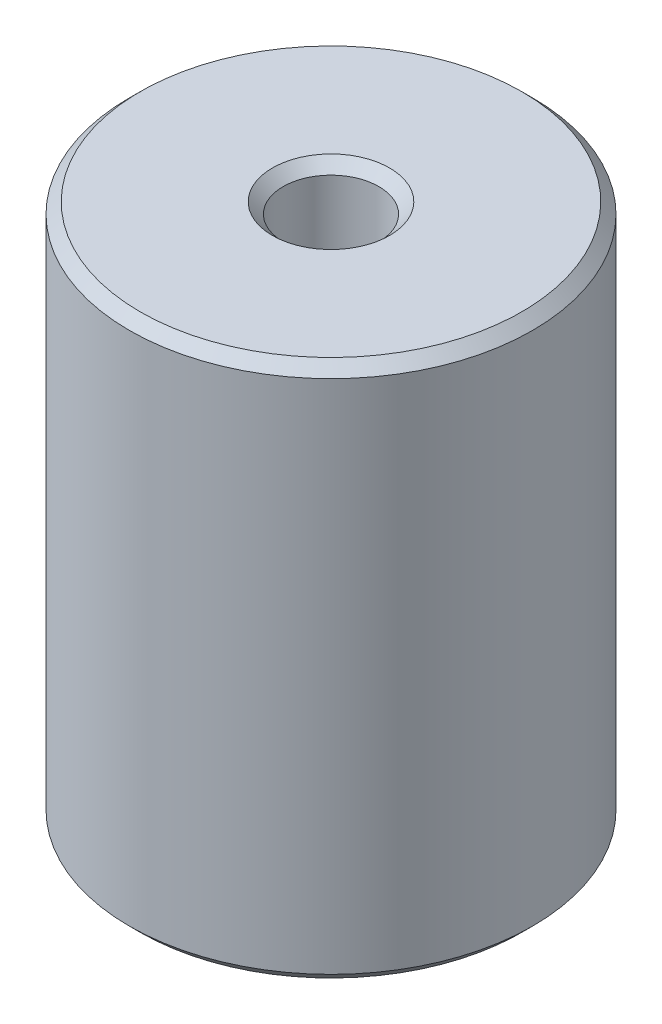
ISO-10303-21;
HEADER;
FILE_DESCRIPTION(('STEP AP214'),'2;1');
FILE_NAME('part.step','',(''),(''),'','','');
FILE_SCHEMA(('AUTOMOTIVE_DESIGN { 1 0 10303 214 1 1 1 1 }'));
ENDSEC;
DATA;
#1=APPLICATION_CONTEXT('core data for automotive mechanical design processes');
#2=APPLICATION_PROTOCOL_DEFINITION('international standard','automotive_design',2000,#1);
#3=PRODUCT_CONTEXT('',#1,'mechanical');
#4=PRODUCT('Part','Part','',(#3));
#5=PRODUCT_RELATED_PRODUCT_CATEGORY('part','',(#4));
#6=PRODUCT_DEFINITION_FORMATION('','',#4);
#7=PRODUCT_DEFINITION_CONTEXT('part definition',#1,'design');
#8=PRODUCT_DEFINITION('design','',#6,#7);
#9=PRODUCT_DEFINITION_SHAPE('','',#8);
#10=(LENGTH_UNIT() NAMED_UNIT(*) SI_UNIT(.MILLI.,.METRE.));
#11=(NAMED_UNIT(*) PLANE_ANGLE_UNIT() SI_UNIT($,.RADIAN.));
#12=(NAMED_UNIT(*) SI_UNIT($,.STERADIAN.) SOLID_ANGLE_UNIT());
#13=UNCERTAINTY_MEASURE_WITH_UNIT(LENGTH_MEASURE(1.E-05),#10,'distance_accuracy_value','');
#14=(GEOMETRIC_REPRESENTATION_CONTEXT(3) GLOBAL_UNCERTAINTY_ASSIGNED_CONTEXT((#13)) GLOBAL_UNIT_ASSIGNED_CONTEXT((#10,
#11,#12)) REPRESENTATION_CONTEXT('',''));
#15=CARTESIAN_POINT('',(0.,0.,0.));
#16=DIRECTION('',(0.,0.,1.));
#17=DIRECTION('',(1.,0.,0.));
#18=AXIS2_PLACEMENT_3D('',#15,#16,#17);
#19=CARTESIAN_POINT('',(0.,12.7,0.));
#20=DIRECTION('',(0.,1.,0.));
#21=DIRECTION('',(0.,0.,1.));
#22=AXIS2_PLACEMENT_3D('',#19,#20,#21);
#23=PLANE('',#22);
#24=CARTESIAN_POINT('',(0.,12.7,0.));
#25=DIRECTION('',(0.,1.,0.));
#26=DIRECTION('',(0.,0.,1.));
#27=AXIS2_PLACEMENT_3D('',#24,#25,#26);
#28=CIRCLE('',#27,1.3843);
#29=CARTESIAN_POINT('',(0.,12.7,1.3843));
#30=VERTEX_POINT('',#29);
#31=EDGE_CURVE('E10',#30,#30,#28,.F.);
#32=ORIENTED_EDGE('',*,*,#31,.T.);
#33=EDGE_LOOP('',(#32));
#34=FACE_BOUND('',#33,.T.);
#35=CARTESIAN_POINT('',(0.,12.7,0.));
#36=DIRECTION('',(0.,1.,0.));
#37=DIRECTION('',(0.,0.,1.));
#38=AXIS2_PLACEMENT_3D('',#35,#36,#37);
#39=CIRCLE('',#38,4.5085);
#40=CARTESIAN_POINT('',(0.,12.7,4.5085));
#41=VERTEX_POINT('',#40);
#42=EDGE_CURVE('E40',#41,#41,#39,.T.);
#43=ORIENTED_EDGE('',*,*,#42,.T.);
#44=EDGE_LOOP('',(#43));
#45=FACE_BOUND('',#44,.T.);
#46=ADVANCED_FACE('F33',(#34,#45),#23,.T.);
#47=CARTESIAN_POINT('',(0.,0.,0.));
#48=DIRECTION('',(0.,1.,0.));
#49=DIRECTION('',(0.,0.,1.));
#50=AXIS2_PLACEMENT_3D('',#47,#48,#49);
#51=PLANE('',#50);
#52=CARTESIAN_POINT('',(0.,0.,0.));
#53=DIRECTION('',(0.,1.,0.));
#54=DIRECTION('',(0.,0.,1.));
#55=AXIS2_PLACEMENT_3D('',#52,#53,#54);
#56=CIRCLE('',#55,1.3843);
#57=CARTESIAN_POINT('',(0.,0.,1.3843));
#58=VERTEX_POINT('',#57);
#59=EDGE_CURVE('E59',#58,#58,#56,.T.);
#60=ORIENTED_EDGE('',*,*,#59,.T.);
#61=EDGE_LOOP('',(#60));
#62=FACE_BOUND('',#61,.T.);
#63=CARTESIAN_POINT('',(0.,0.,0.));
#64=DIRECTION('',(0.,1.,0.));
#65=DIRECTION('',(0.,0.,1.));
#66=AXIS2_PLACEMENT_3D('',#63,#64,#65);
#67=CIRCLE('',#66,4.5085);
#68=CARTESIAN_POINT('',(0.,0.,4.5085));
#69=VERTEX_POINT('',#68);
#70=EDGE_CURVE('E62',#69,#69,#67,.F.);
#71=ORIENTED_EDGE('',*,*,#70,.T.);
#72=EDGE_LOOP('',(#71));
#73=FACE_BOUND('',#72,.T.);
#74=ADVANCED_FACE('F66',(#62,#73),#51,.F.);
#75=CARTESIAN_POINT('',(0.,12.7,0.));
#76=DIRECTION('',(0.,-1.,0.));
#77=DIRECTION('',(0.,0.,-1.));
#78=AXIS2_PLACEMENT_3D('',#75,#76,#77);
#79=CYLINDRICAL_SURFACE('',#78,4.7625);
#80=CARTESIAN_POINT('',(0.,0.253999999999997,0.));
#81=DIRECTION('',(0.,1.,0.));
#82=DIRECTION('',(0.,0.,1.));
#83=AXIS2_PLACEMENT_3D('',#80,#81,#82);
#84=CIRCLE('',#83,4.7625);
#85=CARTESIAN_POINT('',(0.,0.253999999999997,4.7625));
#86=VERTEX_POINT('',#85);
#87=EDGE_CURVE('E44',#86,#86,#84,.T.);
#88=ORIENTED_EDGE('',*,*,#87,.T.);
#89=EDGE_LOOP('',(#88));
#90=FACE_BOUND('',#89,.T.);
#91=CARTESIAN_POINT('',(0.,12.446,0.));
#92=DIRECTION('',(0.,1.,0.));
#93=DIRECTION('',(0.,0.,1.));
#94=AXIS2_PLACEMENT_3D('',#91,#92,#93);
#95=CIRCLE('',#94,4.7625);
#96=CARTESIAN_POINT('',(0.,12.446,4.7625));
#97=VERTEX_POINT('',#96);
#98=EDGE_CURVE('E48',#97,#97,#95,.F.);
#99=ORIENTED_EDGE('',*,*,#98,.T.);
#100=EDGE_LOOP('',(#99));
#101=FACE_BOUND('',#100,.T.);
#102=ADVANCED_FACE('F76',(#90,#101),#79,.T.);
#103=CARTESIAN_POINT('',(0.,12.7,0.));
#104=DIRECTION('',(0.,-1.,0.));
#105=DIRECTION('',(0.,0.,-1.));
#106=AXIS2_PLACEMENT_3D('',#103,#104,#105);
#107=CYLINDRICAL_SURFACE('',#106,1.1303);
#108=CARTESIAN_POINT('',(0.,0.254000000000003,0.));
#109=DIRECTION('',(0.,1.,0.));
#110=DIRECTION('',(0.,0.,1.));
#111=AXIS2_PLACEMENT_3D('',#108,#109,#110);
#112=CIRCLE('',#111,1.1303);
#113=CARTESIAN_POINT('',(0.,0.254000000000003,1.1303));
#114=VERTEX_POINT('',#113);
#115=EDGE_CURVE('E53',#114,#114,#112,.F.);
#116=ORIENTED_EDGE('',*,*,#115,.T.);
#117=EDGE_LOOP('',(#116));
#118=FACE_BOUND('',#117,.T.);
#119=CARTESIAN_POINT('',(0.,12.446,0.));
#120=DIRECTION('',(0.,1.,0.));
#121=DIRECTION('',(0.,0.,1.));
#122=AXIS2_PLACEMENT_3D('',#119,#120,#121);
#123=CIRCLE('',#122,1.1303);
#124=CARTESIAN_POINT('',(0.,12.446,1.1303));
#125=VERTEX_POINT('',#124);
#126=EDGE_CURVE('E56',#125,#125,#123,.T.);
#127=ORIENTED_EDGE('',*,*,#126,.T.);
#128=EDGE_LOOP('',(#127));
#129=FACE_BOUND('',#128,.T.);
#130=ADVANCED_FACE('F79',(#118,#129),#107,.F.);
#131=CARTESIAN_POINT('',(0.,0.,0.));
#132=DIRECTION('',(0.,-1.,0.));
#133=DIRECTION('',(0.,0.,-1.));
#134=AXIS2_PLACEMENT_3D('',#131,#132,#133);
#135=CONICAL_SURFACE('',#134,1.3843,0.785398163397446);
#136=ORIENTED_EDGE('',*,*,#115,.F.);
#137=EDGE_LOOP('',(#136));
#138=FACE_BOUND('',#137,.T.);
#139=ORIENTED_EDGE('',*,*,#59,.F.);
#140=EDGE_LOOP('',(#139));
#141=FACE_BOUND('',#140,.T.);
#142=ADVANCED_FACE('F72',(#138,#141),#135,.F.);
#143=CARTESIAN_POINT('',(0.,0.253999999999997,0.));
#144=DIRECTION('',(0.,1.,0.));
#145=DIRECTION('',(0.,0.,1.));
#146=AXIS2_PLACEMENT_3D('',#143,#144,#145);
#147=CONICAL_SURFACE('',#146,4.7625,0.785398163397453);
#148=ORIENTED_EDGE('',*,*,#70,.F.);
#149=EDGE_LOOP('',(#148));
#150=FACE_BOUND('',#149,.T.);
#151=ORIENTED_EDGE('',*,*,#87,.F.);
#152=EDGE_LOOP('',(#151));
#153=FACE_BOUND('',#152,.T.);
#154=ADVANCED_FACE('F68',(#150,#153),#147,.T.);
#155=CARTESIAN_POINT('',(0.,12.446,0.));
#156=DIRECTION('',(0.,1.,0.));
#157=DIRECTION('',(0.,0.,1.));
#158=AXIS2_PLACEMENT_3D('',#155,#156,#157);
#159=CONICAL_SURFACE('',#158,1.1303,0.785398163397453);
#160=ORIENTED_EDGE('',*,*,#31,.F.);
#161=EDGE_LOOP('',(#160));
#162=FACE_BOUND('',#161,.T.);
#163=ORIENTED_EDGE('',*,*,#126,.F.);
#164=EDGE_LOOP('',(#163));
#165=FACE_BOUND('',#164,.T.);
#166=ADVANCED_FACE('F71',(#162,#165),#159,.F.);
#167=CARTESIAN_POINT('',(0.,12.7,0.));
#168=DIRECTION('',(0.,-1.,0.));
#169=DIRECTION('',(0.,0.,-1.));
#170=AXIS2_PLACEMENT_3D('',#167,#168,#169);
#171=CONICAL_SURFACE('',#170,4.5085,0.78539816339745);
#172=ORIENTED_EDGE('',*,*,#98,.F.);
#173=EDGE_LOOP('',(#172));
#174=FACE_BOUND('',#173,.T.);
#175=ORIENTED_EDGE('',*,*,#42,.F.);
#176=EDGE_LOOP('',(#175));
#177=FACE_BOUND('',#176,.T.);
#178=ADVANCED_FACE('F35',(#174,#177),#171,.T.);
#179=CLOSED_SHELL('',(#46,#74,#102,#130,#142,#154,#166,#178));
#180=MANIFOLD_SOLID_BREP('B2',#179);
#181=ADVANCED_BREP_SHAPE_REPRESENTATION('',(#18,#180),#14);
#182=SHAPE_DEFINITION_REPRESENTATION(#9,#181);
ENDSEC;
END-ISO-10303-21;
